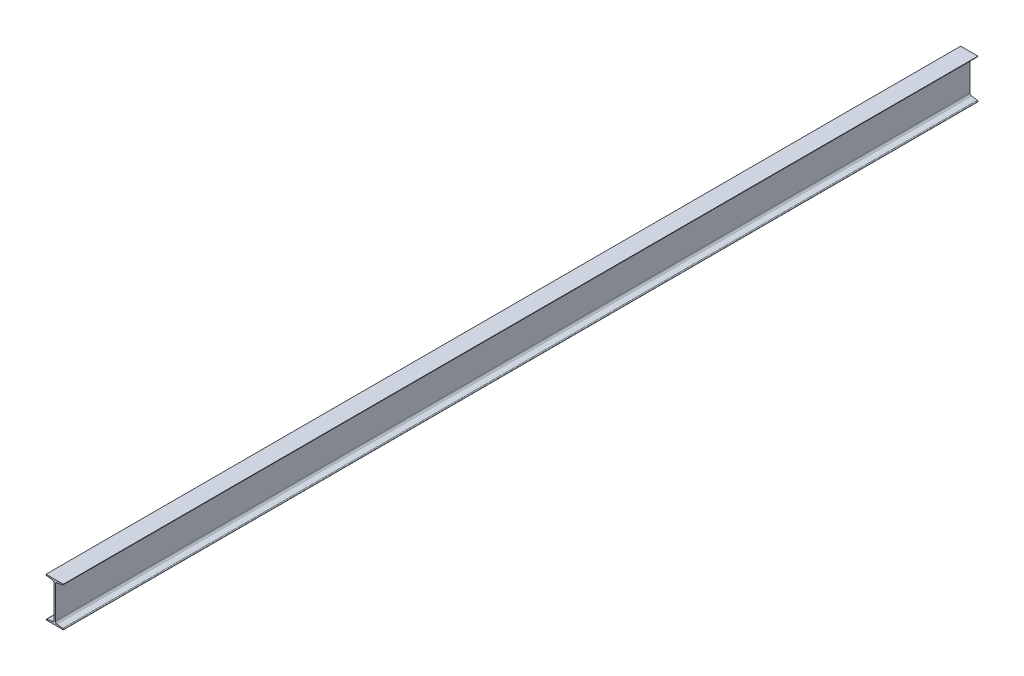
ISO-10303-21;
HEADER;
FILE_DESCRIPTION(('STEP AP214'),'2;1');
FILE_NAME('part.step','',(''),(''),'','','');
FILE_SCHEMA(('AUTOMOTIVE_DESIGN { 1 0 10303 214 1 1 1 1 }'));
ENDSEC;
DATA;
#1=APPLICATION_CONTEXT('core data for automotive mechanical design processes');
#2=APPLICATION_PROTOCOL_DEFINITION('international standard','automotive_design',2000,#1);
#3=PRODUCT_CONTEXT('',#1,'mechanical');
#4=PRODUCT('Part','Part','',(#3));
#5=PRODUCT_RELATED_PRODUCT_CATEGORY('part','',(#4));
#6=PRODUCT_DEFINITION_FORMATION('','',#4);
#7=PRODUCT_DEFINITION_CONTEXT('part definition',#1,'design');
#8=PRODUCT_DEFINITION('design','',#6,#7);
#9=PRODUCT_DEFINITION_SHAPE('','',#8);
#10=(LENGTH_UNIT() NAMED_UNIT(*) SI_UNIT(.MILLI.,.METRE.));
#11=(NAMED_UNIT(*) PLANE_ANGLE_UNIT() SI_UNIT($,.RADIAN.));
#12=(NAMED_UNIT(*) SI_UNIT($,.STERADIAN.) SOLID_ANGLE_UNIT());
#13=UNCERTAINTY_MEASURE_WITH_UNIT(LENGTH_MEASURE(1.E-05),#10,'distance_accuracy_value','');
#14=(GEOMETRIC_REPRESENTATION_CONTEXT(3) GLOBAL_UNCERTAINTY_ASSIGNED_CONTEXT((#13)) GLOBAL_UNIT_ASSIGNED_CONTEXT((#10,
#11,#12)) REPRESENTATION_CONTEXT('',''));
#15=CARTESIAN_POINT('',(0.,0.,0.));
#16=DIRECTION('',(0.,0.,1.));
#17=DIRECTION('',(1.,0.,0.));
#18=AXIS2_PLACEMENT_3D('',#15,#16,#17);
#19=CARTESIAN_POINT('',(66.6750000000003,-152.4,7050.));
#20=DIRECTION('',(0.,1.,0.));
#21=DIRECTION('',(-1.,0.,0.));
#22=AXIS2_PLACEMENT_3D('',#19,#20,#21);
#23=PLANE('',#22);
#24=DIRECTION('',(1.,0.,0.));
#25=VECTOR('',#24,1.);
#26=CARTESIAN_POINT('',(66.6750000000003,-152.4,0.));
#27=LINE('',#26,#25);
#28=CARTESIAN_POINT('',(-66.6749999999997,-152.4,0.));
#29=VERTEX_POINT('',#28);
#30=CARTESIAN_POINT('',(66.6750000000003,-152.4,0.));
#31=VERTEX_POINT('',#30);
#32=EDGE_CURVE('E207',#29,#31,#27,.T.);
#33=ORIENTED_EDGE('',*,*,#32,.T.);
#34=DIRECTION('',(0.,0.,-1.));
#35=VECTOR('',#34,1.);
#36=CARTESIAN_POINT('',(66.6750000000003,-152.4,7050.));
#37=LINE('',#36,#35);
#38=CARTESIAN_POINT('',(66.6750000000003,-152.4,7050.));
#39=VERTEX_POINT('',#38);
#40=EDGE_CURVE('E11',#39,#31,#37,.T.);
#41=ORIENTED_EDGE('',*,*,#40,.F.);
#42=DIRECTION('',(1.,0.,0.));
#43=VECTOR('',#42,1.);
#44=CARTESIAN_POINT('',(66.6750000000003,-152.4,7050.));
#45=LINE('',#44,#43);
#46=CARTESIAN_POINT('',(-66.6749999999997,-152.4,7050.));
#47=VERTEX_POINT('',#46);
#48=EDGE_CURVE('E245',#47,#39,#45,.T.);
#49=ORIENTED_EDGE('',*,*,#48,.F.);
#50=DIRECTION('',(0.,0.,-1.));
#51=VECTOR('',#50,1.);
#52=CARTESIAN_POINT('',(-66.6749999999997,-152.4,7050.));
#53=LINE('',#52,#51);
#54=EDGE_CURVE('E203',#47,#29,#53,.T.);
#55=ORIENTED_EDGE('',*,*,#54,.T.);
#56=EDGE_LOOP('',(#33,#41,#49,#55));
#57=FACE_BOUND('',#56,.T.);
#58=ADVANCED_FACE('F39',(#57),#23,.F.);
#59=CARTESIAN_POINT('',(66.6750000000003,-152.036345520012,7050.));
#60=DIRECTION('',(-1.,0.,0.));
#61=DIRECTION('',(0.,0.,1.));
#62=AXIS2_PLACEMENT_3D('',#59,#60,#61);
#63=PLANE('',#62);
#64=DIRECTION('',(0.,1.,0.));
#65=VECTOR('',#64,1.);
#66=CARTESIAN_POINT('',(66.6750000000003,-152.036345520012,0.));
#67=LINE('',#66,#65);
#68=CARTESIAN_POINT('',(66.6750000000003,-152.036345520012,0.));
#69=VERTEX_POINT('',#68);
#70=EDGE_CURVE('E210',#31,#69,#67,.T.);
#71=ORIENTED_EDGE('',*,*,#70,.T.);
#72=DIRECTION('',(0.,0.,-1.));
#73=VECTOR('',#72,1.);
#74=CARTESIAN_POINT('',(66.6750000000003,-152.036345520012,7050.));
#75=LINE('',#74,#73);
#76=CARTESIAN_POINT('',(66.6750000000003,-152.036345520012,7050.));
#77=VERTEX_POINT('',#76);
#78=EDGE_CURVE('E47',#77,#69,#75,.T.);
#79=ORIENTED_EDGE('',*,*,#78,.F.);
#80=DIRECTION('',(0.,1.,0.));
#81=VECTOR('',#80,1.);
#82=CARTESIAN_POINT('',(66.6750000000003,-152.036345520012,7050.));
#83=LINE('',#82,#81);
#84=EDGE_CURVE('E134',#39,#77,#83,.T.);
#85=ORIENTED_EDGE('',*,*,#84,.F.);
#86=ORIENTED_EDGE('',*,*,#40,.T.);
#87=EDGE_LOOP('',(#71,#79,#85,#86));
#88=FACE_BOUND('',#87,.T.);
#89=ADVANCED_FACE('F363',(#88),#63,.F.);
#90=CARTESIAN_POINT('',(59.5630000000004,-152.036345520012,7050.));
#91=DIRECTION('',(0.,0.,-1.));
#92=DIRECTION('',(-1.,0.,0.));
#93=AXIS2_PLACEMENT_3D('',#90,#91,#92);
#94=CYLINDRICAL_SURFACE('',#93,7.112);
#95=CARTESIAN_POINT('',(59.5630000000004,-152.036345520012,0.));
#96=DIRECTION('',(0.,0.,1.));
#97=DIRECTION('',(-1.,0.,0.));
#98=AXIS2_PLACEMENT_3D('',#95,#96,#97);
#99=CIRCLE('',#98,7.112);
#100=CARTESIAN_POINT('',(60.731921268104,-145.021064551371,0.));
#101=VERTEX_POINT('',#100);
#102=EDGE_CURVE('E212',#69,#101,#99,.T.);
#103=ORIENTED_EDGE('',*,*,#102,.T.);
#104=DIRECTION('',(0.,0.,-1.));
#105=VECTOR('',#104,1.);
#106=CARTESIAN_POINT('',(60.731921268104,-145.021064551371,7050.));
#107=LINE('',#106,#105);
#108=CARTESIAN_POINT('',(60.731921268104,-145.021064551371,7050.));
#109=VERTEX_POINT('',#108);
#110=EDGE_CURVE('E288',#109,#101,#107,.T.);
#111=ORIENTED_EDGE('',*,*,#110,.F.);
#112=CARTESIAN_POINT('',(59.5630000000004,-152.036345520012,7050.));
#113=DIRECTION('',(0.,0.,1.));
#114=DIRECTION('',(-1.,0.,0.));
#115=AXIS2_PLACEMENT_3D('',#112,#113,#114);
#116=CIRCLE('',#115,7.112);
#117=EDGE_CURVE('E296',#77,#109,#116,.T.);
#118=ORIENTED_EDGE('',*,*,#117,.F.);
#119=ORIENTED_EDGE('',*,*,#78,.T.);
#120=EDGE_LOOP('',(#103,#111,#118,#119));
#121=FACE_BOUND('',#120,.T.);
#122=ADVANCED_FACE('F294',(#121),#94,.T.);
#123=CARTESIAN_POINT('',(17.7281574637928,-137.855561937282,7050.));
#124=DIRECTION('',(-0.164359008451028,-0.986400586141855,0.));
#125=DIRECTION('',(0.986400586141855,-0.164359008451028,0.));
#126=AXIS2_PLACEMENT_3D('',#123,#124,#125);
#127=PLANE('',#126);
#128=DIRECTION('',(-0.986400586141855,0.164359008451028,0.));
#129=VECTOR('',#128,1.);
#130=CARTESIAN_POINT('',(17.7281574637928,-137.855561937282,0.));
#131=LINE('',#130,#129);
#132=CARTESIAN_POINT('',(17.7281574637928,-137.855561937282,0.));
#133=VERTEX_POINT('',#132);
#134=EDGE_CURVE('E214',#101,#133,#131,.T.);
#135=ORIENTED_EDGE('',*,*,#134,.T.);
#136=DIRECTION('',(0.,0.,-1.));
#137=VECTOR('',#136,1.);
#138=CARTESIAN_POINT('',(17.7281574637928,-137.855561937282,7050.));
#139=LINE('',#138,#137);
#140=CARTESIAN_POINT('',(17.7281574637928,-137.855561937282,7050.));
#141=VERTEX_POINT('',#140);
#142=EDGE_CURVE('E285',#141,#133,#139,.T.);
#143=ORIENTED_EDGE('',*,*,#142,.F.);
#144=DIRECTION('',(-0.986400586141855,0.164359008451028,0.));
#145=VECTOR('',#144,1.);
#146=CARTESIAN_POINT('',(17.7281574637928,-137.855561937282,7050.));
#147=LINE('',#146,#145);
#148=EDGE_CURVE('E314',#109,#141,#147,.T.);
#149=ORIENTED_EDGE('',*,*,#148,.F.);
#150=ORIENTED_EDGE('',*,*,#110,.T.);
#151=EDGE_LOOP('',(#135,#143,#149,#150));
#152=FACE_BOUND('',#151,.T.);
#153=ADVANCED_FACE('F305',(#152),#127,.F.);
#154=CARTESIAN_POINT('',(20.0660000000003,-123.825,7050.));
#155=DIRECTION('',(0.,0.,-1.));
#156=DIRECTION('',(-1.,0.,0.));
#157=AXIS2_PLACEMENT_3D('',#154,#155,#156);
#158=CYLINDRICAL_SURFACE('',#157,14.224);
#159=CARTESIAN_POINT('',(20.0660000000003,-123.825,0.));
#160=DIRECTION('',(0.,0.,-1.));
#161=DIRECTION('',(1.,0.,0.));
#162=AXIS2_PLACEMENT_3D('',#159,#160,#161);
#163=CIRCLE('',#162,14.224);
#164=CARTESIAN_POINT('',(5.84200000000027,-123.825,0.));
#165=VERTEX_POINT('',#164);
#166=EDGE_CURVE('E216',#133,#165,#163,.T.);
#167=ORIENTED_EDGE('',*,*,#166,.T.);
#168=DIRECTION('',(0.,0.,-1.));
#169=VECTOR('',#168,1.);
#170=CARTESIAN_POINT('',(5.84200000000027,-123.825,7050.));
#171=LINE('',#170,#169);
#172=CARTESIAN_POINT('',(5.84200000000027,-123.825,7050.));
#173=VERTEX_POINT('',#172);
#174=EDGE_CURVE('E282',#173,#165,#171,.T.);
#175=ORIENTED_EDGE('',*,*,#174,.F.);
#176=CARTESIAN_POINT('',(20.0660000000003,-123.825,7050.));
#177=DIRECTION('',(0.,0.,-1.));
#178=DIRECTION('',(1.,0.,0.));
#179=AXIS2_PLACEMENT_3D('',#176,#177,#178);
#180=CIRCLE('',#179,14.224);
#181=EDGE_CURVE('E311',#141,#173,#180,.T.);
#182=ORIENTED_EDGE('',*,*,#181,.F.);
#183=ORIENTED_EDGE('',*,*,#142,.T.);
#184=EDGE_LOOP('',(#167,#175,#182,#183));
#185=FACE_BOUND('',#184,.T.);
#186=ADVANCED_FACE('F309',(#185),#158,.F.);
#187=CARTESIAN_POINT('',(5.84199999999973,123.825,7050.));
#188=DIRECTION('',(-1.,0.,0.));
#189=DIRECTION('',(0.,-1.,0.));
#190=AXIS2_PLACEMENT_3D('',#187,#188,#189);
#191=PLANE('',#190);
#192=DIRECTION('',(0.,1.,0.));
#193=VECTOR('',#192,1.);
#194=CARTESIAN_POINT('',(5.84199999999973,123.825,0.));
#195=LINE('',#194,#193);
#196=CARTESIAN_POINT('',(5.84199999999972,123.825,0.));
#197=VERTEX_POINT('',#196);
#198=EDGE_CURVE('E218',#165,#197,#195,.T.);
#199=ORIENTED_EDGE('',*,*,#198,.T.);
#200=DIRECTION('',(0.,0.,-1.));
#201=VECTOR('',#200,1.);
#202=CARTESIAN_POINT('',(5.84199999999972,123.825,7050.));
#203=LINE('',#202,#201);
#204=CARTESIAN_POINT('',(5.84199999999972,123.825,7050.));
#205=VERTEX_POINT('',#204);
#206=EDGE_CURVE('E279',#205,#197,#203,.T.);
#207=ORIENTED_EDGE('',*,*,#206,.F.);
#208=DIRECTION('',(0.,1.,0.));
#209=VECTOR('',#208,1.);
#210=CARTESIAN_POINT('',(5.84199999999973,123.825,7050.));
#211=LINE('',#210,#209);
#212=EDGE_CURVE('E313',#173,#205,#211,.T.);
#213=ORIENTED_EDGE('',*,*,#212,.F.);
#214=ORIENTED_EDGE('',*,*,#174,.T.);
#215=EDGE_LOOP('',(#199,#207,#213,#214));
#216=FACE_BOUND('',#215,.T.);
#217=ADVANCED_FACE('F376',(#216),#191,.F.);
#218=CARTESIAN_POINT('',(20.0659999999997,123.825,7050.));
#219=DIRECTION('',(0.,0.,-1.));
#220=DIRECTION('',(-1.,0.,0.));
#221=AXIS2_PLACEMENT_3D('',#218,#219,#220);
#222=CYLINDRICAL_SURFACE('',#221,14.224);
#223=CARTESIAN_POINT('',(20.0659999999997,123.825,0.));
#224=DIRECTION('',(0.,0.,-1.));
#225=DIRECTION('',(1.,0.,0.));
#226=AXIS2_PLACEMENT_3D('',#223,#224,#225);
#227=CIRCLE('',#226,14.224);
#228=CARTESIAN_POINT('',(17.7281574637922,137.855561937282,0.));
#229=VERTEX_POINT('',#228);
#230=EDGE_CURVE('E220',#197,#229,#227,.T.);
#231=ORIENTED_EDGE('',*,*,#230,.T.);
#232=DIRECTION('',(0.,0.,-1.));
#233=VECTOR('',#232,1.);
#234=CARTESIAN_POINT('',(17.7281574637922,137.855561937282,7050.));
#235=LINE('',#234,#233);
#236=CARTESIAN_POINT('',(17.7281574637922,137.855561937282,7050.));
#237=VERTEX_POINT('',#236);
#238=EDGE_CURVE('E276',#237,#229,#235,.T.);
#239=ORIENTED_EDGE('',*,*,#238,.F.);
#240=CARTESIAN_POINT('',(20.0659999999997,123.825,7050.));
#241=DIRECTION('',(0.,0.,-1.));
#242=DIRECTION('',(1.,0.,0.));
#243=AXIS2_PLACEMENT_3D('',#240,#241,#242);
#244=CIRCLE('',#243,14.224);
#245=EDGE_CURVE('E316',#205,#237,#244,.T.);
#246=ORIENTED_EDGE('',*,*,#245,.F.);
#247=ORIENTED_EDGE('',*,*,#206,.T.);
#248=EDGE_LOOP('',(#231,#239,#246,#247));
#249=FACE_BOUND('',#248,.T.);
#250=ADVANCED_FACE('F379',(#249),#222,.F.);
#251=CARTESIAN_POINT('',(60.7319212681034,145.021064551371,7050.));
#252=DIRECTION('',(-0.164359008451033,0.986400586141854,0.));
#253=DIRECTION('',(-0.986400586141854,-0.164359008451033,0.));
#254=AXIS2_PLACEMENT_3D('',#251,#252,#253);
#255=PLANE('',#254);
#256=DIRECTION('',(0.986400586141854,0.164359008451033,0.));
#257=VECTOR('',#256,1.);
#258=CARTESIAN_POINT('',(60.7319212681034,145.021064551371,0.));
#259=LINE('',#258,#257);
#260=CARTESIAN_POINT('',(60.7319212681034,145.021064551371,0.));
#261=VERTEX_POINT('',#260);
#262=EDGE_CURVE('E222',#229,#261,#259,.T.);
#263=ORIENTED_EDGE('',*,*,#262,.T.);
#264=DIRECTION('',(0.,0.,-1.));
#265=VECTOR('',#264,1.);
#266=CARTESIAN_POINT('',(60.7319212681034,145.021064551371,7050.));
#267=LINE('',#266,#265);
#268=CARTESIAN_POINT('',(60.7319212681034,145.021064551371,7050.));
#269=VERTEX_POINT('',#268);
#270=EDGE_CURVE('E273',#269,#261,#267,.T.);
#271=ORIENTED_EDGE('',*,*,#270,.F.);
#272=DIRECTION('',(0.986400586141854,0.164359008451033,0.));
#273=VECTOR('',#272,1.);
#274=CARTESIAN_POINT('',(60.7319212681034,145.021064551371,7050.));
#275=LINE('',#274,#273);
#276=EDGE_CURVE('E322',#237,#269,#275,.T.);
#277=ORIENTED_EDGE('',*,*,#276,.F.);
#278=ORIENTED_EDGE('',*,*,#238,.T.);
#279=EDGE_LOOP('',(#263,#271,#277,#278));
#280=FACE_BOUND('',#279,.T.);
#281=ADVANCED_FACE('F383',(#280),#255,.F.);
#282=CARTESIAN_POINT('',(59.5629999999997,152.036345520012,7050.));
#283=DIRECTION('',(0.,0.,-1.));
#284=DIRECTION('',(-1.,0.,0.));
#285=AXIS2_PLACEMENT_3D('',#282,#283,#284);
#286=CYLINDRICAL_SURFACE('',#285,7.112);
#287=CARTESIAN_POINT('',(59.5629999999997,152.036345520012,0.));
#288=DIRECTION('',(0.,0.,1.));
#289=DIRECTION('',(1.,0.,0.));
#290=AXIS2_PLACEMENT_3D('',#287,#288,#289);
#291=CIRCLE('',#290,7.112);
#292=CARTESIAN_POINT('',(66.6749999999997,152.036345520012,0.));
#293=VERTEX_POINT('',#292);
#294=EDGE_CURVE('E224',#261,#293,#291,.T.);
#295=ORIENTED_EDGE('',*,*,#294,.T.);
#296=DIRECTION('',(0.,0.,-1.));
#297=VECTOR('',#296,1.);
#298=CARTESIAN_POINT('',(66.6749999999997,152.036345520012,7050.));
#299=LINE('',#298,#297);
#300=CARTESIAN_POINT('',(66.6749999999997,152.036345520012,7050.));
#301=VERTEX_POINT('',#300);
#302=EDGE_CURVE('E270',#301,#293,#299,.T.);
#303=ORIENTED_EDGE('',*,*,#302,.F.);
#304=CARTESIAN_POINT('',(59.5629999999997,152.036345520012,7050.));
#305=DIRECTION('',(0.,0.,1.));
#306=DIRECTION('',(1.,0.,0.));
#307=AXIS2_PLACEMENT_3D('',#304,#305,#306);
#308=CIRCLE('',#307,7.112);
#309=EDGE_CURVE('E324',#269,#301,#308,.T.);
#310=ORIENTED_EDGE('',*,*,#309,.F.);
#311=ORIENTED_EDGE('',*,*,#270,.T.);
#312=EDGE_LOOP('',(#295,#303,#310,#311));
#313=FACE_BOUND('',#312,.T.);
#314=ADVANCED_FACE('F387',(#313),#286,.T.);
#315=CARTESIAN_POINT('',(66.6749999999997,152.4,7050.));
#316=DIRECTION('',(-1.,0.,0.));
#317=DIRECTION('',(0.,0.,1.));
#318=AXIS2_PLACEMENT_3D('',#315,#316,#317);
#319=PLANE('',#318);
#320=DIRECTION('',(0.,1.,0.));
#321=VECTOR('',#320,1.);
#322=CARTESIAN_POINT('',(66.6749999999997,152.4,0.));
#323=LINE('',#322,#321);
#324=CARTESIAN_POINT('',(66.6749999999997,152.4,0.));
#325=VERTEX_POINT('',#324);
#326=EDGE_CURVE('E226',#293,#325,#323,.T.);
#327=ORIENTED_EDGE('',*,*,#326,.T.);
#328=DIRECTION('',(0.,0.,-1.));
#329=VECTOR('',#328,1.);
#330=CARTESIAN_POINT('',(66.6749999999997,152.4,7050.));
#331=LINE('',#330,#329);
#332=CARTESIAN_POINT('',(66.6749999999997,152.4,7050.));
#333=VERTEX_POINT('',#332);
#334=EDGE_CURVE('E267',#333,#325,#331,.T.);
#335=ORIENTED_EDGE('',*,*,#334,.F.);
#336=DIRECTION('',(0.,1.,0.));
#337=VECTOR('',#336,1.);
#338=CARTESIAN_POINT('',(66.6749999999997,152.4,7050.));
#339=LINE('',#338,#337);
#340=EDGE_CURVE('E326',#301,#333,#339,.T.);
#341=ORIENTED_EDGE('',*,*,#340,.F.);
#342=ORIENTED_EDGE('',*,*,#302,.T.);
#343=EDGE_LOOP('',(#327,#335,#341,#342));
#344=FACE_BOUND('',#343,.T.);
#345=ADVANCED_FACE('F391',(#344),#319,.F.);
#346=CARTESIAN_POINT('',(-66.6750000000003,152.4,7050.));
#347=DIRECTION('',(0.,-1.,0.));
#348=DIRECTION('',(1.,0.,0.));
#349=AXIS2_PLACEMENT_3D('',#346,#347,#348);
#350=PLANE('',#349);
#351=DIRECTION('',(-1.,0.,0.));
#352=VECTOR('',#351,1.);
#353=CARTESIAN_POINT('',(-66.6750000000003,152.4,0.));
#354=LINE('',#353,#352);
#355=CARTESIAN_POINT('',(-66.6750000000003,152.4,0.));
#356=VERTEX_POINT('',#355);
#357=EDGE_CURVE('E228',#325,#356,#354,.T.);
#358=ORIENTED_EDGE('',*,*,#357,.T.);
#359=DIRECTION('',(0.,0.,-1.));
#360=VECTOR('',#359,1.);
#361=CARTESIAN_POINT('',(-66.6750000000003,152.4,7050.));
#362=LINE('',#361,#360);
#363=CARTESIAN_POINT('',(-66.6750000000003,152.4,7050.));
#364=VERTEX_POINT('',#363);
#365=EDGE_CURVE('E264',#364,#356,#362,.T.);
#366=ORIENTED_EDGE('',*,*,#365,.F.);
#367=DIRECTION('',(-1.,0.,0.));
#368=VECTOR('',#367,1.);
#369=CARTESIAN_POINT('',(-66.6750000000003,152.4,7050.));
#370=LINE('',#369,#368);
#371=EDGE_CURVE('E328',#333,#364,#370,.T.);
#372=ORIENTED_EDGE('',*,*,#371,.F.);
#373=ORIENTED_EDGE('',*,*,#334,.T.);
#374=EDGE_LOOP('',(#358,#366,#372,#373));
#375=FACE_BOUND('',#374,.T.);
#376=ADVANCED_FACE('F395',(#375),#350,.F.);
#377=CARTESIAN_POINT('',(-66.6750000000003,152.036345520012,7050.));
#378=DIRECTION('',(1.,0.,0.));
#379=DIRECTION('',(0.,0.,-1.));
#380=AXIS2_PLACEMENT_3D('',#377,#378,#379);
#381=PLANE('',#380);
#382=DIRECTION('',(0.,-1.,0.));
#383=VECTOR('',#382,1.);
#384=CARTESIAN_POINT('',(-66.6750000000003,152.036345520012,0.));
#385=LINE('',#384,#383);
#386=CARTESIAN_POINT('',(-66.6750000000003,152.036345520012,0.));
#387=VERTEX_POINT('',#386);
#388=EDGE_CURVE('E230',#356,#387,#385,.T.);
#389=ORIENTED_EDGE('',*,*,#388,.T.);
#390=DIRECTION('',(0.,0.,-1.));
#391=VECTOR('',#390,1.);
#392=CARTESIAN_POINT('',(-66.6750000000003,152.036345520012,7050.));
#393=LINE('',#392,#391);
#394=CARTESIAN_POINT('',(-66.6750000000003,152.036345520012,7050.));
#395=VERTEX_POINT('',#394);
#396=EDGE_CURVE('E261',#395,#387,#393,.T.);
#397=ORIENTED_EDGE('',*,*,#396,.F.);
#398=DIRECTION('',(0.,-1.,0.));
#399=VECTOR('',#398,1.);
#400=CARTESIAN_POINT('',(-66.6750000000003,152.036345520012,7050.));
#401=LINE('',#400,#399);
#402=EDGE_CURVE('E330',#364,#395,#401,.T.);
#403=ORIENTED_EDGE('',*,*,#402,.F.);
#404=ORIENTED_EDGE('',*,*,#365,.T.);
#405=EDGE_LOOP('',(#389,#397,#403,#404));
#406=FACE_BOUND('',#405,.T.);
#407=ADVANCED_FACE('F399',(#406),#381,.F.);
#408=CARTESIAN_POINT('',(-59.5630000000003,152.036345520012,7050.));
#409=DIRECTION('',(0.,0.,-1.));
#410=DIRECTION('',(-1.,0.,0.));
#411=AXIS2_PLACEMENT_3D('',#408,#409,#410);
#412=CYLINDRICAL_SURFACE('',#411,7.11200000000001);
#413=CARTESIAN_POINT('',(-59.5630000000003,152.036345520012,0.));
#414=DIRECTION('',(0.,0.,1.));
#415=DIRECTION('',(-1.,0.,0.));
#416=AXIS2_PLACEMENT_3D('',#413,#414,#415);
#417=CIRCLE('',#416,7.11200000000001);
#418=CARTESIAN_POINT('',(-60.731921268104,145.021064551371,0.));
#419=VERTEX_POINT('',#418);
#420=EDGE_CURVE('E232',#387,#419,#417,.T.);
#421=ORIENTED_EDGE('',*,*,#420,.T.);
#422=DIRECTION('',(0.,0.,-1.));
#423=VECTOR('',#422,1.);
#424=CARTESIAN_POINT('',(-60.731921268104,145.021064551371,7050.));
#425=LINE('',#424,#423);
#426=CARTESIAN_POINT('',(-60.731921268104,145.021064551371,7050.));
#427=VERTEX_POINT('',#426);
#428=EDGE_CURVE('E258',#427,#419,#425,.T.);
#429=ORIENTED_EDGE('',*,*,#428,.F.);
#430=CARTESIAN_POINT('',(-59.5630000000003,152.036345520012,7050.));
#431=DIRECTION('',(0.,0.,1.));
#432=DIRECTION('',(-1.,0.,0.));
#433=AXIS2_PLACEMENT_3D('',#430,#431,#432);
#434=CIRCLE('',#433,7.11200000000001);
#435=EDGE_CURVE('E332',#395,#427,#434,.T.);
#436=ORIENTED_EDGE('',*,*,#435,.F.);
#437=ORIENTED_EDGE('',*,*,#396,.T.);
#438=EDGE_LOOP('',(#421,#429,#436,#437));
#439=FACE_BOUND('',#438,.T.);
#440=ADVANCED_FACE('F403',(#439),#412,.T.);
#441=CARTESIAN_POINT('',(-17.7281574637928,137.855561937282,7050.));
#442=DIRECTION('',(0.16435900845103,0.986400586141855,0.));
#443=DIRECTION('',(-0.986400586141855,0.16435900845103,0.));
#444=AXIS2_PLACEMENT_3D('',#441,#442,#443);
#445=PLANE('',#444);
#446=DIRECTION('',(0.986400586141855,-0.16435900845103,0.));
#447=VECTOR('',#446,1.);
#448=CARTESIAN_POINT('',(-17.7281574637928,137.855561937282,0.));
#449=LINE('',#448,#447);
#450=CARTESIAN_POINT('',(-17.7281574637928,137.855561937282,0.));
#451=VERTEX_POINT('',#450);
#452=EDGE_CURVE('E234',#419,#451,#449,.T.);
#453=ORIENTED_EDGE('',*,*,#452,.T.);
#454=DIRECTION('',(0.,0.,-1.));
#455=VECTOR('',#454,1.);
#456=CARTESIAN_POINT('',(-17.7281574637928,137.855561937282,7050.));
#457=LINE('',#456,#455);
#458=CARTESIAN_POINT('',(-17.7281574637928,137.855561937282,7050.));
#459=VERTEX_POINT('',#458);
#460=EDGE_CURVE('E255',#459,#451,#457,.T.);
#461=ORIENTED_EDGE('',*,*,#460,.F.);
#462=DIRECTION('',(0.986400586141855,-0.16435900845103,0.));
#463=VECTOR('',#462,1.);
#464=CARTESIAN_POINT('',(-17.7281574637928,137.855561937282,7050.));
#465=LINE('',#464,#463);
#466=EDGE_CURVE('E334',#427,#459,#465,.T.);
#467=ORIENTED_EDGE('',*,*,#466,.F.);
#468=ORIENTED_EDGE('',*,*,#428,.T.);
#469=EDGE_LOOP('',(#453,#461,#467,#468));
#470=FACE_BOUND('',#469,.T.);
#471=ADVANCED_FACE('F407',(#470),#445,.F.);
#472=CARTESIAN_POINT('',(-20.0660000000003,123.825,7050.));
#473=DIRECTION('',(0.,0.,-1.));
#474=DIRECTION('',(-1.,0.,0.));
#475=AXIS2_PLACEMENT_3D('',#472,#473,#474);
#476=CYLINDRICAL_SURFACE('',#475,14.224);
#477=CARTESIAN_POINT('',(-20.0660000000003,123.825,0.));
#478=DIRECTION('',(0.,0.,-1.));
#479=DIRECTION('',(1.,0.,0.));
#480=AXIS2_PLACEMENT_3D('',#477,#478,#479);
#481=CIRCLE('',#480,14.224);
#482=CARTESIAN_POINT('',(-5.84200000000027,123.825,0.));
#483=VERTEX_POINT('',#482);
#484=EDGE_CURVE('E236',#451,#483,#481,.T.);
#485=ORIENTED_EDGE('',*,*,#484,.T.);
#486=DIRECTION('',(0.,0.,-1.));
#487=VECTOR('',#486,1.);
#488=CARTESIAN_POINT('',(-5.84200000000027,123.825,7050.));
#489=LINE('',#488,#487);
#490=CARTESIAN_POINT('',(-5.84200000000027,123.825,7050.));
#491=VERTEX_POINT('',#490);
#492=EDGE_CURVE('E252',#491,#483,#489,.T.);
#493=ORIENTED_EDGE('',*,*,#492,.F.);
#494=CARTESIAN_POINT('',(-20.0660000000003,123.825,7050.));
#495=DIRECTION('',(0.,0.,-1.));
#496=DIRECTION('',(1.,0.,0.));
#497=AXIS2_PLACEMENT_3D('',#494,#495,#496);
#498=CIRCLE('',#497,14.224);
#499=EDGE_CURVE('E336',#459,#491,#498,.T.);
#500=ORIENTED_EDGE('',*,*,#499,.F.);
#501=ORIENTED_EDGE('',*,*,#460,.T.);
#502=EDGE_LOOP('',(#485,#493,#500,#501));
#503=FACE_BOUND('',#502,.T.);
#504=ADVANCED_FACE('F411',(#503),#476,.F.);
#505=CARTESIAN_POINT('',(-5.84199999999973,-123.825,7050.));
#506=DIRECTION('',(1.,0.,0.));
#507=DIRECTION('',(0.,1.,0.));
#508=AXIS2_PLACEMENT_3D('',#505,#506,#507);
#509=PLANE('',#508);
#510=DIRECTION('',(0.,-1.,0.));
#511=VECTOR('',#510,1.);
#512=CARTESIAN_POINT('',(-5.84199999999973,-123.825,0.));
#513=LINE('',#512,#511);
#514=CARTESIAN_POINT('',(-5.84199999999973,-123.825,0.));
#515=VERTEX_POINT('',#514);
#516=EDGE_CURVE('E238',#483,#515,#513,.T.);
#517=ORIENTED_EDGE('',*,*,#516,.T.);
#518=DIRECTION('',(0.,0.,-1.));
#519=VECTOR('',#518,1.);
#520=CARTESIAN_POINT('',(-5.84199999999973,-123.825,7050.));
#521=LINE('',#520,#519);
#522=CARTESIAN_POINT('',(-5.84199999999973,-123.825,7050.));
#523=VERTEX_POINT('',#522);
#524=EDGE_CURVE('E249',#523,#515,#521,.T.);
#525=ORIENTED_EDGE('',*,*,#524,.F.);
#526=DIRECTION('',(0.,-1.,0.));
#527=VECTOR('',#526,1.);
#528=CARTESIAN_POINT('',(-5.84199999999973,-123.825,7050.));
#529=LINE('',#528,#527);
#530=EDGE_CURVE('E338',#491,#523,#529,.T.);
#531=ORIENTED_EDGE('',*,*,#530,.F.);
#532=ORIENTED_EDGE('',*,*,#492,.T.);
#533=EDGE_LOOP('',(#517,#525,#531,#532));
#534=FACE_BOUND('',#533,.T.);
#535=ADVANCED_FACE('F344',(#534),#509,.F.);
#536=CARTESIAN_POINT('',(-20.0659999999997,-123.825,7050.));
#537=DIRECTION('',(0.,0.,-1.));
#538=DIRECTION('',(-1.,0.,0.));
#539=AXIS2_PLACEMENT_3D('',#536,#537,#538);
#540=CYLINDRICAL_SURFACE('',#539,14.224);
#541=CARTESIAN_POINT('',(-20.0659999999997,-123.825,0.));
#542=DIRECTION('',(0.,0.,-1.));
#543=DIRECTION('',(1.,0.,0.));
#544=AXIS2_PLACEMENT_3D('',#541,#542,#543);
#545=CIRCLE('',#544,14.224);
#546=CARTESIAN_POINT('',(-17.7281574637922,-137.855561937282,0.));
#547=VERTEX_POINT('',#546);
#548=EDGE_CURVE('E240',#515,#547,#545,.T.);
#549=ORIENTED_EDGE('',*,*,#548,.T.);
#550=DIRECTION('',(0.,0.,-1.));
#551=VECTOR('',#550,1.);
#552=CARTESIAN_POINT('',(-17.7281574637922,-137.855561937282,7050.));
#553=LINE('',#552,#551);
#554=CARTESIAN_POINT('',(-17.7281574637922,-137.855561937282,7050.));
#555=VERTEX_POINT('',#554);
#556=EDGE_CURVE('E198',#555,#547,#553,.T.);
#557=ORIENTED_EDGE('',*,*,#556,.F.);
#558=CARTESIAN_POINT('',(-20.0659999999997,-123.825,7050.));
#559=DIRECTION('',(0.,0.,-1.));
#560=DIRECTION('',(1.,0.,0.));
#561=AXIS2_PLACEMENT_3D('',#558,#559,#560);
#562=CIRCLE('',#561,14.224);
#563=EDGE_CURVE('E189',#523,#555,#562,.T.);
#564=ORIENTED_EDGE('',*,*,#563,.F.);
#565=ORIENTED_EDGE('',*,*,#524,.T.);
#566=EDGE_LOOP('',(#549,#557,#564,#565));
#567=FACE_BOUND('',#566,.T.);
#568=ADVANCED_FACE('F348',(#567),#540,.F.);
#569=CARTESIAN_POINT('',(-60.7319212681034,-145.021064551371,7050.));
#570=DIRECTION('',(0.164359008451033,-0.986400586141854,0.));
#571=DIRECTION('',(0.986400586141854,0.164359008451033,0.));
#572=AXIS2_PLACEMENT_3D('',#569,#570,#571);
#573=PLANE('',#572);
#574=DIRECTION('',(-0.986400586141854,-0.164359008451033,0.));
#575=VECTOR('',#574,1.);
#576=CARTESIAN_POINT('',(-60.7319212681034,-145.021064551371,0.));
#577=LINE('',#576,#575);
#578=CARTESIAN_POINT('',(-60.7319212681034,-145.021064551371,0.));
#579=VERTEX_POINT('',#578);
#580=EDGE_CURVE('E197',#547,#579,#577,.T.);
#581=ORIENTED_EDGE('',*,*,#580,.T.);
#582=DIRECTION('',(0.,0.,-1.));
#583=VECTOR('',#582,1.);
#584=CARTESIAN_POINT('',(-60.7319212681034,-145.021064551371,7050.));
#585=LINE('',#584,#583);
#586=CARTESIAN_POINT('',(-60.7319212681034,-145.021064551371,7050.));
#587=VERTEX_POINT('',#586);
#588=EDGE_CURVE('E194',#587,#579,#585,.T.);
#589=ORIENTED_EDGE('',*,*,#588,.F.);
#590=DIRECTION('',(-0.986400586141854,-0.164359008451033,0.));
#591=VECTOR('',#590,1.);
#592=CARTESIAN_POINT('',(-60.7319212681034,-145.021064551371,7050.));
#593=LINE('',#592,#591);
#594=EDGE_CURVE('E183',#555,#587,#593,.T.);
#595=ORIENTED_EDGE('',*,*,#594,.F.);
#596=ORIENTED_EDGE('',*,*,#556,.T.);
#597=EDGE_LOOP('',(#581,#589,#595,#596));
#598=FACE_BOUND('',#597,.T.);
#599=ADVANCED_FACE('F195',(#598),#573,.F.);
#600=CARTESIAN_POINT('',(-59.5629999999997,-152.036345520012,7050.));
#601=DIRECTION('',(0.,0.,-1.));
#602=DIRECTION('',(-1.,0.,0.));
#603=AXIS2_PLACEMENT_3D('',#600,#601,#602);
#604=CYLINDRICAL_SURFACE('',#603,7.112);
#605=CARTESIAN_POINT('',(-59.5629999999997,-152.036345520012,0.));
#606=DIRECTION('',(0.,0.,1.));
#607=DIRECTION('',(1.,0.,0.));
#608=AXIS2_PLACEMENT_3D('',#605,#606,#607);
#609=CIRCLE('',#608,7.112);
#610=CARTESIAN_POINT('',(-66.6749999999997,-152.036345520012,0.));
#611=VERTEX_POINT('',#610);
#612=EDGE_CURVE('E120',#579,#611,#609,.T.);
#613=ORIENTED_EDGE('',*,*,#612,.T.);
#614=DIRECTION('',(0.,0.,-1.));
#615=VECTOR('',#614,1.);
#616=CARTESIAN_POINT('',(-66.6749999999997,-152.036345520012,7050.));
#617=LINE('',#616,#615);
#618=CARTESIAN_POINT('',(-66.6749999999997,-152.036345520012,7050.));
#619=VERTEX_POINT('',#618);
#620=EDGE_CURVE('E199',#619,#611,#617,.T.);
#621=ORIENTED_EDGE('',*,*,#620,.F.);
#622=CARTESIAN_POINT('',(-59.5629999999997,-152.036345520012,7050.));
#623=DIRECTION('',(0.,0.,1.));
#624=DIRECTION('',(1.,0.,0.));
#625=AXIS2_PLACEMENT_3D('',#622,#623,#624);
#626=CIRCLE('',#625,7.112);
#627=EDGE_CURVE('E187',#587,#619,#626,.T.);
#628=ORIENTED_EDGE('',*,*,#627,.F.);
#629=ORIENTED_EDGE('',*,*,#588,.T.);
#630=EDGE_LOOP('',(#613,#621,#628,#629));
#631=FACE_BOUND('',#630,.T.);
#632=ADVANCED_FACE('F201',(#631),#604,.T.);
#633=CARTESIAN_POINT('',(-66.6749999999997,-152.4,7050.));
#634=DIRECTION('',(1.,0.,0.));
#635=DIRECTION('',(0.,1.,0.));
#636=AXIS2_PLACEMENT_3D('',#633,#634,#635);
#637=PLANE('',#636);
#638=DIRECTION('',(0.,-1.,0.));
#639=VECTOR('',#638,1.);
#640=CARTESIAN_POINT('',(-66.6749999999997,-152.4,0.));
#641=LINE('',#640,#639);
#642=EDGE_CURVE('E126',#611,#29,#641,.T.);
#643=ORIENTED_EDGE('',*,*,#642,.T.);
#644=ORIENTED_EDGE('',*,*,#54,.F.);
#645=DIRECTION('',(0.,-1.,0.));
#646=VECTOR('',#645,1.);
#647=CARTESIAN_POINT('',(-66.6749999999997,-152.4,7050.));
#648=LINE('',#647,#646);
#649=EDGE_CURVE('E55',#619,#47,#648,.T.);
#650=ORIENTED_EDGE('',*,*,#649,.F.);
#651=ORIENTED_EDGE('',*,*,#620,.T.);
#652=EDGE_LOOP('',(#643,#644,#650,#651));
#653=FACE_BOUND('',#652,.T.);
#654=ADVANCED_FACE('F352',(#653),#637,.F.);
#655=CARTESIAN_POINT('',(-59.5629999999997,-152.036345520012,7050.));
#656=DIRECTION('',(0.,0.,1.));
#657=DIRECTION('',(1.,0.,0.));
#658=AXIS2_PLACEMENT_3D('',#655,#656,#657);
#659=PLANE('',#658);
#660=ORIENTED_EDGE('',*,*,#48,.T.);
#661=ORIENTED_EDGE('',*,*,#84,.T.);
#662=ORIENTED_EDGE('',*,*,#117,.T.);
#663=ORIENTED_EDGE('',*,*,#148,.T.);
#664=ORIENTED_EDGE('',*,*,#181,.T.);
#665=ORIENTED_EDGE('',*,*,#212,.T.);
#666=ORIENTED_EDGE('',*,*,#245,.T.);
#667=ORIENTED_EDGE('',*,*,#276,.T.);
#668=ORIENTED_EDGE('',*,*,#309,.T.);
#669=ORIENTED_EDGE('',*,*,#340,.T.);
#670=ORIENTED_EDGE('',*,*,#371,.T.);
#671=ORIENTED_EDGE('',*,*,#402,.T.);
#672=ORIENTED_EDGE('',*,*,#435,.T.);
#673=ORIENTED_EDGE('',*,*,#466,.T.);
#674=ORIENTED_EDGE('',*,*,#499,.T.);
#675=ORIENTED_EDGE('',*,*,#530,.T.);
#676=ORIENTED_EDGE('',*,*,#563,.T.);
#677=ORIENTED_EDGE('',*,*,#594,.T.);
#678=ORIENTED_EDGE('',*,*,#627,.T.);
#679=ORIENTED_EDGE('',*,*,#649,.T.);
#680=EDGE_LOOP('',(#660,#661,#662,#663,#664,#665,#666,#667,#668,#669,#670,#671,#672,#673,#674,
#675,#676,#677,#678,#679));
#681=FACE_BOUND('',#680,.T.);
#682=ADVANCED_FACE('F185',(#681),#659,.T.);
#683=CARTESIAN_POINT('',(-59.5629999999997,-152.036345520012,0.));
#684=DIRECTION('',(0.,0.,1.));
#685=DIRECTION('',(1.,0.,0.));
#686=AXIS2_PLACEMENT_3D('',#683,#684,#685);
#687=PLANE('',#686);
#688=ORIENTED_EDGE('',*,*,#32,.F.);
#689=ORIENTED_EDGE('',*,*,#642,.F.);
#690=ORIENTED_EDGE('',*,*,#612,.F.);
#691=ORIENTED_EDGE('',*,*,#580,.F.);
#692=ORIENTED_EDGE('',*,*,#548,.F.);
#693=ORIENTED_EDGE('',*,*,#516,.F.);
#694=ORIENTED_EDGE('',*,*,#484,.F.);
#695=ORIENTED_EDGE('',*,*,#452,.F.);
#696=ORIENTED_EDGE('',*,*,#420,.F.);
#697=ORIENTED_EDGE('',*,*,#388,.F.);
#698=ORIENTED_EDGE('',*,*,#357,.F.);
#699=ORIENTED_EDGE('',*,*,#326,.F.);
#700=ORIENTED_EDGE('',*,*,#294,.F.);
#701=ORIENTED_EDGE('',*,*,#262,.F.);
#702=ORIENTED_EDGE('',*,*,#230,.F.);
#703=ORIENTED_EDGE('',*,*,#198,.F.);
#704=ORIENTED_EDGE('',*,*,#166,.F.);
#705=ORIENTED_EDGE('',*,*,#134,.F.);
#706=ORIENTED_EDGE('',*,*,#102,.F.);
#707=ORIENTED_EDGE('',*,*,#70,.F.);
#708=EDGE_LOOP('',(#688,#689,#690,#691,#692,#693,#694,#695,#696,#697,#698,#699,#700,#701,#702,
#703,#704,#705,#706,#707));
#709=FACE_BOUND('',#708,.T.);
#710=ADVANCED_FACE('F300',(#709),#687,.F.);
#711=CLOSED_SHELL('',(#58,#89,#122,#153,#186,#217,#250,#281,#314,#345,#376,#407,#440,#471,#504,
#535,#568,#599,#632,#654,#682,#710));
#712=MANIFOLD_SOLID_BREP('B2',#711);
#713=ADVANCED_BREP_SHAPE_REPRESENTATION('',(#18,#712),#14);
#714=SHAPE_DEFINITION_REPRESENTATION(#9,#713);
ENDSEC;
END-ISO-10303-21;
